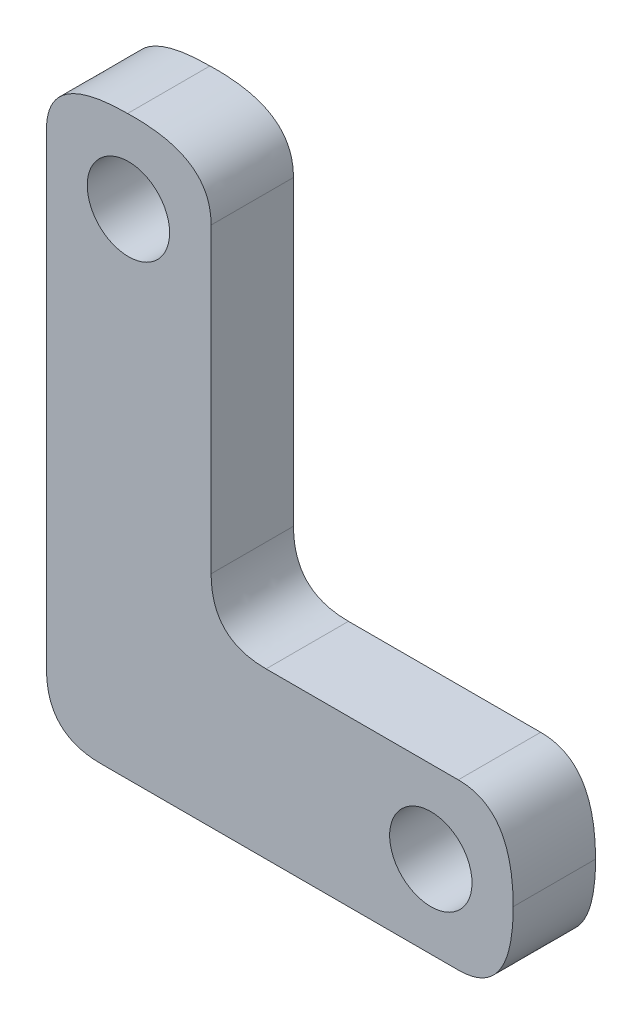
ISO-10303-21;
HEADER;
FILE_DESCRIPTION(('STEP AP214'),'2;1');
FILE_NAME('part.step','',(''),(''),'','','');
FILE_SCHEMA(('AUTOMOTIVE_DESIGN { 1 0 10303 214 1 1 1 1 }'));
ENDSEC;
DATA;
#1=APPLICATION_CONTEXT('core data for automotive mechanical design processes');
#2=APPLICATION_PROTOCOL_DEFINITION('international standard','automotive_design',2000,#1);
#3=PRODUCT_CONTEXT('',#1,'mechanical');
#4=PRODUCT('Part','Part','',(#3));
#5=PRODUCT_RELATED_PRODUCT_CATEGORY('part','',(#4));
#6=PRODUCT_DEFINITION_FORMATION('','',#4);
#7=PRODUCT_DEFINITION_CONTEXT('part definition',#1,'design');
#8=PRODUCT_DEFINITION('design','',#6,#7);
#9=PRODUCT_DEFINITION_SHAPE('','',#8);
#10=(LENGTH_UNIT() NAMED_UNIT(*) SI_UNIT(.MILLI.,.METRE.));
#11=(NAMED_UNIT(*) PLANE_ANGLE_UNIT() SI_UNIT($,.RADIAN.));
#12=(NAMED_UNIT(*) SI_UNIT($,.STERADIAN.) SOLID_ANGLE_UNIT());
#13=UNCERTAINTY_MEASURE_WITH_UNIT(LENGTH_MEASURE(1.E-05),#10,'distance_accuracy_value','');
#14=(GEOMETRIC_REPRESENTATION_CONTEXT(3) GLOBAL_UNCERTAINTY_ASSIGNED_CONTEXT((#13)) GLOBAL_UNIT_ASSIGNED_CONTEXT((#10,
#11,#12)) REPRESENTATION_CONTEXT('',''));
#15=CARTESIAN_POINT('',(0.,0.,0.));
#16=DIRECTION('',(0.,0.,1.));
#17=DIRECTION('',(1.,0.,0.));
#18=AXIS2_PLACEMENT_3D('',#15,#16,#17);
#19=CARTESIAN_POINT('',(0.738825140300366,20.495925714441,3.));
#20=DIRECTION('',(0.,0.,1.));
#21=DIRECTION('',(1.,0.,0.));
#22=AXIS2_PLACEMENT_3D('',#19,#20,#21);
#23=PLANE('',#22);
#24=CARTESIAN_POINT('',(14.,3.,3.));
#25=DIRECTION('',(0.,0.,1.));
#26=DIRECTION('',(1.,0.,0.));
#27=AXIS2_PLACEMENT_3D('',#24,#25,#26);
#28=CIRCLE('',#27,1.5);
#29=CARTESIAN_POINT('',(15.5,3.,3.));
#30=VERTEX_POINT('',#29);
#31=EDGE_CURVE('E244',#30,#30,#28,.T.);
#32=ORIENTED_EDGE('',*,*,#31,.F.);
#33=EDGE_LOOP('',(#32));
#34=FACE_BOUND('',#33,.T.);
#35=CARTESIAN_POINT('',(2.95530056120146,20.9945676192547,3.));
#36=CARTESIAN_POINT('',(0.,20.9945676192547,3.));
#37=CARTESIAN_POINT('',(0.,19.,3.));
#38=B_SPLINE_CURVE_WITH_KNOTS('',2,(#35,#36,#37),.UNSPECIFIED.,.F.,.F.,(3,3),(0.,1.),.UNSPECIFIED.);
#39=CARTESIAN_POINT('',(2.95530056120146,20.9945676192547,3.));
#40=VERTEX_POINT('',#39);
#41=CARTESIAN_POINT('',(0.,19.,3.));
#42=VERTEX_POINT('',#41);
#43=EDGE_CURVE('E248',#40,#42,#38,.T.);
#44=ORIENTED_EDGE('',*,*,#43,.T.);
#45=DIRECTION('',(0.,-1.,0.));
#46=VECTOR('',#45,1.);
#47=CARTESIAN_POINT('',(0.,2.,3.));
#48=LINE('',#47,#46);
#49=CARTESIAN_POINT('',(0.,2.,3.));
#50=VERTEX_POINT('',#49);
#51=EDGE_CURVE('E100',#42,#50,#48,.T.);
#52=ORIENTED_EDGE('',*,*,#51,.T.);
#53=CARTESIAN_POINT('',(0.,2.,3.));
#54=CARTESIAN_POINT('',(0.,0.,3.));
#55=CARTESIAN_POINT('',(2.,0.,3.));
#56=B_SPLINE_CURVE_WITH_KNOTS('',2,(#53,#54,#55),.UNSPECIFIED.,.F.,.F.,(3,3),(0.,1.),.UNSPECIFIED.);
#57=CARTESIAN_POINT('',(2.,0.,3.));
#58=VERTEX_POINT('',#57);
#59=EDGE_CURVE('E197',#50,#58,#56,.T.);
#60=ORIENTED_EDGE('',*,*,#59,.T.);
#61=DIRECTION('',(1.,0.,0.));
#62=VECTOR('',#61,1.);
#63=CARTESIAN_POINT('',(2.,0.,3.));
#64=LINE('',#63,#62);
#65=CARTESIAN_POINT('',(15.0001395445826,0.,3.));
#66=VERTEX_POINT('',#65);
#67=EDGE_CURVE('E192',#58,#66,#64,.T.);
#68=ORIENTED_EDGE('',*,*,#67,.T.);
#69=CARTESIAN_POINT('',(15.0001395445826,0.,3.));
#70=CARTESIAN_POINT('',(17.,0.,3.));
#71=CARTESIAN_POINT('',(17.,3.,3.));
#72=B_SPLINE_CURVE_WITH_KNOTS('',2,(#69,#70,#71),.UNSPECIFIED.,.F.,.F.,(3,3),(0.,1.),.UNSPECIFIED.);
#73=CARTESIAN_POINT('',(17.,3.,3.));
#74=VERTEX_POINT('',#73);
#75=EDGE_CURVE('E184',#66,#74,#72,.T.);
#76=ORIENTED_EDGE('',*,*,#75,.T.);
#77=CARTESIAN_POINT('',(17.,3.,3.));
#78=CARTESIAN_POINT('',(17.,6.,3.));
#79=CARTESIAN_POINT('',(15.,6.,3.));
#80=B_SPLINE_CURVE_WITH_KNOTS('',2,(#77,#78,#79),.UNSPECIFIED.,.F.,.F.,(3,3),(0.,1.),.UNSPECIFIED.);
#81=CARTESIAN_POINT('',(15.,6.,3.));
#82=VERTEX_POINT('',#81);
#83=EDGE_CURVE('E180',#74,#82,#80,.T.);
#84=ORIENTED_EDGE('',*,*,#83,.T.);
#85=DIRECTION('',(-1.,0.,0.));
#86=VECTOR('',#85,1.);
#87=CARTESIAN_POINT('',(8.,6.,3.));
#88=LINE('',#87,#86);
#89=CARTESIAN_POINT('',(8.,6.,3.));
#90=VERTEX_POINT('',#89);
#91=EDGE_CURVE('E125',#82,#90,#88,.T.);
#92=ORIENTED_EDGE('',*,*,#91,.T.);
#93=CARTESIAN_POINT('',(8.,6.,3.));
#94=CARTESIAN_POINT('',(6.,6.,3.));
#95=CARTESIAN_POINT('',(6.,8.,3.));
#96=B_SPLINE_CURVE_WITH_KNOTS('',2,(#93,#94,#95),.UNSPECIFIED.,.F.,.F.,(3,3),(0.,1.),.UNSPECIFIED.);
#97=CARTESIAN_POINT('',(6.,8.,3.));
#98=VERTEX_POINT('',#97);
#99=EDGE_CURVE('E119',#90,#98,#96,.T.);
#100=ORIENTED_EDGE('',*,*,#99,.T.);
#101=DIRECTION('',(0.,1.,0.));
#102=VECTOR('',#101,1.);
#103=CARTESIAN_POINT('',(6.,19.,3.));
#104=LINE('',#103,#102);
#105=CARTESIAN_POINT('',(6.,19.,3.));
#106=VERTEX_POINT('',#105);
#107=EDGE_CURVE('E123',#98,#106,#104,.T.);
#108=ORIENTED_EDGE('',*,*,#107,.T.);
#109=CARTESIAN_POINT('',(6.,19.,3.));
#110=CARTESIAN_POINT('',(5.9912377139321,21.0798174930143,3.));
#111=CARTESIAN_POINT('',(2.95530056120146,20.9945676192547,3.));
#112=B_SPLINE_CURVE_WITH_KNOTS('',2,(#109,#110,#111),.UNSPECIFIED.,.F.,.F.,(3,3),(0.,1.),.UNSPECIFIED.);
#113=EDGE_CURVE('E51',#106,#40,#112,.T.);
#114=ORIENTED_EDGE('',*,*,#113,.T.);
#115=EDGE_LOOP('',(#44,#52,#60,#68,#76,#84,#92,#100,#108,#114));
#116=FACE_BOUND('',#115,.T.);
#117=CARTESIAN_POINT('',(2.9859145073773,17.9947238256048,3.));
#118=DIRECTION('',(0.,0.,1.));
#119=DIRECTION('',(1.,0.,0.));
#120=AXIS2_PLACEMENT_3D('',#117,#118,#119);
#121=CIRCLE('',#120,1.5);
#122=CARTESIAN_POINT('',(4.4859145073773,17.9947238256048,3.));
#123=VERTEX_POINT('',#122);
#124=EDGE_CURVE('E235',#123,#123,#121,.T.);
#125=ORIENTED_EDGE('',*,*,#124,.F.);
#126=EDGE_LOOP('',(#125));
#127=FACE_BOUND('',#126,.T.);
#128=ADVANCED_FACE('F33',(#34,#116,#127),#23,.T.);
#129=CARTESIAN_POINT('',(0.738825140300366,20.495925714441,0.));
#130=DIRECTION('',(0.,0.,1.));
#131=DIRECTION('',(1.,0.,0.));
#132=AXIS2_PLACEMENT_3D('',#129,#130,#131);
#133=PLANE('',#132);
#134=CARTESIAN_POINT('',(2.95530056120146,20.9945676192547,0.));
#135=CARTESIAN_POINT('',(0.,20.9945676192547,0.));
#136=CARTESIAN_POINT('',(0.,19.,0.));
#137=B_SPLINE_CURVE_WITH_KNOTS('',2,(#134,#135,#136),.UNSPECIFIED.,.F.,.F.,(3,3),(0.,1.),.UNSPECIFIED.);
#138=CARTESIAN_POINT('',(2.95530056120146,20.9945676192547,0.));
#139=VERTEX_POINT('',#138);
#140=CARTESIAN_POINT('',(0.,19.,0.));
#141=VERTEX_POINT('',#140);
#142=EDGE_CURVE('E149',#139,#141,#137,.T.);
#143=ORIENTED_EDGE('',*,*,#142,.F.);
#144=CARTESIAN_POINT('',(6.,19.,0.));
#145=CARTESIAN_POINT('',(5.9912377139321,21.0798174930143,0.));
#146=CARTESIAN_POINT('',(2.95530056120146,20.9945676192547,0.));
#147=B_SPLINE_CURVE_WITH_KNOTS('',2,(#144,#145,#146),.UNSPECIFIED.,.F.,.F.,(3,3),(0.,1.),.UNSPECIFIED.);
#148=CARTESIAN_POINT('',(6.,19.,0.));
#149=VERTEX_POINT('',#148);
#150=EDGE_CURVE('E92',#149,#139,#147,.T.);
#151=ORIENTED_EDGE('',*,*,#150,.F.);
#152=DIRECTION('',(0.,1.,0.));
#153=VECTOR('',#152,1.);
#154=CARTESIAN_POINT('',(6.,19.,0.));
#155=LINE('',#154,#153);
#156=CARTESIAN_POINT('',(6.,8.,0.));
#157=VERTEX_POINT('',#156);
#158=EDGE_CURVE('E86',#157,#149,#155,.T.);
#159=ORIENTED_EDGE('',*,*,#158,.F.);
#160=CARTESIAN_POINT('',(8.,6.,0.));
#161=CARTESIAN_POINT('',(6.,6.,0.));
#162=CARTESIAN_POINT('',(6.,8.,0.));
#163=B_SPLINE_CURVE_WITH_KNOTS('',2,(#160,#161,#162),.UNSPECIFIED.,.F.,.F.,(3,3),(0.,1.),.UNSPECIFIED.);
#164=CARTESIAN_POINT('',(8.,6.,0.));
#165=VERTEX_POINT('',#164);
#166=EDGE_CURVE('E133',#165,#157,#163,.T.);
#167=ORIENTED_EDGE('',*,*,#166,.F.);
#168=DIRECTION('',(-1.,0.,0.));
#169=VECTOR('',#168,1.);
#170=CARTESIAN_POINT('',(8.,6.,0.));
#171=LINE('',#170,#169);
#172=CARTESIAN_POINT('',(15.,6.,0.));
#173=VERTEX_POINT('',#172);
#174=EDGE_CURVE('E310',#173,#165,#171,.T.);
#175=ORIENTED_EDGE('',*,*,#174,.F.);
#176=CARTESIAN_POINT('',(17.,3.,0.));
#177=CARTESIAN_POINT('',(17.,6.,0.));
#178=CARTESIAN_POINT('',(15.,6.,0.));
#179=B_SPLINE_CURVE_WITH_KNOTS('',2,(#176,#177,#178),.UNSPECIFIED.,.F.,.F.,(3,3),(0.,1.),.UNSPECIFIED.);
#180=CARTESIAN_POINT('',(17.,3.,0.));
#181=VERTEX_POINT('',#180);
#182=EDGE_CURVE('E303',#181,#173,#179,.T.);
#183=ORIENTED_EDGE('',*,*,#182,.F.);
#184=CARTESIAN_POINT('',(15.0001395445826,0.,0.));
#185=CARTESIAN_POINT('',(17.,0.,0.));
#186=CARTESIAN_POINT('',(17.,3.,0.));
#187=B_SPLINE_CURVE_WITH_KNOTS('',2,(#184,#185,#186),.UNSPECIFIED.,.F.,.F.,(3,3),(0.,1.),.UNSPECIFIED.);
#188=CARTESIAN_POINT('',(15.0001395445826,0.,0.));
#189=VERTEX_POINT('',#188);
#190=EDGE_CURVE('E292',#189,#181,#187,.T.);
#191=ORIENTED_EDGE('',*,*,#190,.F.);
#192=DIRECTION('',(1.,0.,0.));
#193=VECTOR('',#192,1.);
#194=CARTESIAN_POINT('',(2.,0.,0.));
#195=LINE('',#194,#193);
#196=CARTESIAN_POINT('',(2.,0.,0.));
#197=VERTEX_POINT('',#196);
#198=EDGE_CURVE('E290',#197,#189,#195,.T.);
#199=ORIENTED_EDGE('',*,*,#198,.F.);
#200=CARTESIAN_POINT('',(0.,2.,0.));
#201=CARTESIAN_POINT('',(0.,0.,0.));
#202=CARTESIAN_POINT('',(2.,0.,0.));
#203=B_SPLINE_CURVE_WITH_KNOTS('',2,(#200,#201,#202),.UNSPECIFIED.,.F.,.F.,(3,3),(0.,1.),.UNSPECIFIED.);
#204=CARTESIAN_POINT('',(0.,2.,0.));
#205=VERTEX_POINT('',#204);
#206=EDGE_CURVE('E284',#205,#197,#203,.T.);
#207=ORIENTED_EDGE('',*,*,#206,.F.);
#208=DIRECTION('',(0.,-1.,0.));
#209=VECTOR('',#208,1.);
#210=CARTESIAN_POINT('',(0.,2.,0.));
#211=LINE('',#210,#209);
#212=EDGE_CURVE('E288',#141,#205,#211,.T.);
#213=ORIENTED_EDGE('',*,*,#212,.F.);
#214=EDGE_LOOP('',(#143,#151,#159,#167,#175,#183,#191,#199,#207,#213));
#215=FACE_BOUND('',#214,.T.);
#216=CARTESIAN_POINT('',(14.,3.,0.));
#217=DIRECTION('',(0.,0.,1.));
#218=DIRECTION('',(1.,0.,0.));
#219=AXIS2_PLACEMENT_3D('',#216,#217,#218);
#220=CIRCLE('',#219,1.5);
#221=CARTESIAN_POINT('',(15.5,3.,0.));
#222=VERTEX_POINT('',#221);
#223=EDGE_CURVE('E241',#222,#222,#220,.T.);
#224=ORIENTED_EDGE('',*,*,#223,.T.);
#225=EDGE_LOOP('',(#224));
#226=FACE_BOUND('',#225,.T.);
#227=CARTESIAN_POINT('',(2.9859145073773,17.9947238256048,0.));
#228=DIRECTION('',(0.,0.,1.));
#229=DIRECTION('',(1.,0.,0.));
#230=AXIS2_PLACEMENT_3D('',#227,#228,#229);
#231=CIRCLE('',#230,1.5);
#232=CARTESIAN_POINT('',(4.4859145073773,17.9947238256048,0.));
#233=VERTEX_POINT('',#232);
#234=EDGE_CURVE('E238',#233,#233,#231,.T.);
#235=ORIENTED_EDGE('',*,*,#234,.T.);
#236=EDGE_LOOP('',(#235));
#237=FACE_BOUND('',#236,.T.);
#238=ADVANCED_FACE('F162',(#215,#226,#237),#133,.F.);
#239=DIRECTION('',(0.,0.,-1.));
#240=VECTOR('',#239,1.);
#241=SURFACE_OF_LINEAR_EXTRUSION('',#38,#240);
#242=ORIENTED_EDGE('',*,*,#142,.T.);
#243=DIRECTION('',(0.,0.,-1.));
#244=VECTOR('',#243,1.);
#245=CARTESIAN_POINT('',(0.,19.,3.));
#246=LINE('',#245,#244);
#247=EDGE_CURVE('E11',#42,#141,#246,.T.);
#248=ORIENTED_EDGE('',*,*,#247,.F.);
#249=ORIENTED_EDGE('',*,*,#43,.F.);
#250=DIRECTION('',(0.,0.,-1.));
#251=VECTOR('',#250,1.);
#252=CARTESIAN_POINT('',(2.95530056120146,20.9945676192547,3.));
#253=LINE('',#252,#251);
#254=EDGE_CURVE('E139',#40,#139,#253,.T.);
#255=ORIENTED_EDGE('',*,*,#254,.T.);
#256=EDGE_LOOP('',(#242,#248,#249,#255));
#257=FACE_BOUND('',#256,.T.);
#258=ADVANCED_FACE('F35',(#257),#241,.F.);
#259=CARTESIAN_POINT('',(0.,2.,3.));
#260=DIRECTION('',(1.,0.,0.));
#261=DIRECTION('',(0.,0.,-1.));
#262=AXIS2_PLACEMENT_3D('',#259,#260,#261);
#263=PLANE('',#262);
#264=ORIENTED_EDGE('',*,*,#212,.T.);
#265=DIRECTION('',(0.,0.,-1.));
#266=VECTOR('',#265,1.);
#267=CARTESIAN_POINT('',(0.,2.,3.));
#268=LINE('',#267,#266);
#269=EDGE_CURVE('E43',#50,#205,#268,.T.);
#270=ORIENTED_EDGE('',*,*,#269,.F.);
#271=ORIENTED_EDGE('',*,*,#51,.F.);
#272=ORIENTED_EDGE('',*,*,#247,.T.);
#273=EDGE_LOOP('',(#264,#270,#271,#272));
#274=FACE_BOUND('',#273,.T.);
#275=ADVANCED_FACE('F209',(#274),#263,.F.);
#276=DIRECTION('',(0.,0.,-1.));
#277=VECTOR('',#276,1.);
#278=SURFACE_OF_LINEAR_EXTRUSION('',#56,#277);
#279=ORIENTED_EDGE('',*,*,#206,.T.);
#280=DIRECTION('',(0.,0.,-1.));
#281=VECTOR('',#280,1.);
#282=CARTESIAN_POINT('',(2.,0.,3.));
#283=LINE('',#282,#281);
#284=EDGE_CURVE('E278',#58,#197,#283,.T.);
#285=ORIENTED_EDGE('',*,*,#284,.F.);
#286=ORIENTED_EDGE('',*,*,#59,.F.);
#287=ORIENTED_EDGE('',*,*,#269,.T.);
#288=EDGE_LOOP('',(#279,#285,#286,#287));
#289=FACE_BOUND('',#288,.T.);
#290=ADVANCED_FACE('F206',(#289),#278,.F.);
#291=CARTESIAN_POINT('',(2.,0.,3.));
#292=DIRECTION('',(0.,1.,0.));
#293=DIRECTION('',(0.,0.,1.));
#294=AXIS2_PLACEMENT_3D('',#291,#292,#293);
#295=PLANE('',#294);
#296=ORIENTED_EDGE('',*,*,#198,.T.);
#297=DIRECTION('',(0.,0.,-1.));
#298=VECTOR('',#297,1.);
#299=CARTESIAN_POINT('',(15.0001395445826,0.,3.));
#300=LINE('',#299,#298);
#301=EDGE_CURVE('E275',#66,#189,#300,.T.);
#302=ORIENTED_EDGE('',*,*,#301,.F.);
#303=ORIENTED_EDGE('',*,*,#67,.F.);
#304=ORIENTED_EDGE('',*,*,#284,.T.);
#305=EDGE_LOOP('',(#296,#302,#303,#304));
#306=FACE_BOUND('',#305,.T.);
#307=ADVANCED_FACE('F208',(#306),#295,.F.);
#308=DIRECTION('',(0.,0.,-1.));
#309=VECTOR('',#308,1.);
#310=SURFACE_OF_LINEAR_EXTRUSION('',#72,#309);
#311=ORIENTED_EDGE('',*,*,#190,.T.);
#312=DIRECTION('',(0.,0.,-1.));
#313=VECTOR('',#312,1.);
#314=CARTESIAN_POINT('',(17.,3.,3.));
#315=LINE('',#314,#313);
#316=EDGE_CURVE('E272',#74,#181,#315,.T.);
#317=ORIENTED_EDGE('',*,*,#316,.F.);
#318=ORIENTED_EDGE('',*,*,#75,.F.);
#319=ORIENTED_EDGE('',*,*,#301,.T.);
#320=EDGE_LOOP('',(#311,#317,#318,#319));
#321=FACE_BOUND('',#320,.T.);
#322=ADVANCED_FACE('F176',(#321),#310,.F.);
#323=DIRECTION('',(0.,0.,-1.));
#324=VECTOR('',#323,1.);
#325=SURFACE_OF_LINEAR_EXTRUSION('',#80,#324);
#326=ORIENTED_EDGE('',*,*,#182,.T.);
#327=DIRECTION('',(0.,0.,-1.));
#328=VECTOR('',#327,1.);
#329=CARTESIAN_POINT('',(15.,6.,3.));
#330=LINE('',#329,#328);
#331=EDGE_CURVE('E269',#82,#173,#330,.T.);
#332=ORIENTED_EDGE('',*,*,#331,.F.);
#333=ORIENTED_EDGE('',*,*,#83,.F.);
#334=ORIENTED_EDGE('',*,*,#316,.T.);
#335=EDGE_LOOP('',(#326,#332,#333,#334));
#336=FACE_BOUND('',#335,.T.);
#337=ADVANCED_FACE('F171',(#336),#325,.F.);
#338=CARTESIAN_POINT('',(8.,6.,3.));
#339=DIRECTION('',(0.,-1.,0.));
#340=DIRECTION('',(0.,0.,-1.));
#341=AXIS2_PLACEMENT_3D('',#338,#339,#340);
#342=PLANE('',#341);
#343=ORIENTED_EDGE('',*,*,#174,.T.);
#344=DIRECTION('',(0.,0.,-1.));
#345=VECTOR('',#344,1.);
#346=CARTESIAN_POINT('',(8.,6.,3.));
#347=LINE('',#346,#345);
#348=EDGE_CURVE('E134',#90,#165,#347,.T.);
#349=ORIENTED_EDGE('',*,*,#348,.F.);
#350=ORIENTED_EDGE('',*,*,#91,.F.);
#351=ORIENTED_EDGE('',*,*,#331,.T.);
#352=EDGE_LOOP('',(#343,#349,#350,#351));
#353=FACE_BOUND('',#352,.T.);
#354=ADVANCED_FACE('F168',(#353),#342,.F.);
#355=DIRECTION('',(0.,0.,-1.));
#356=VECTOR('',#355,1.);
#357=SURFACE_OF_LINEAR_EXTRUSION('',#96,#356);
#358=ORIENTED_EDGE('',*,*,#166,.T.);
#359=DIRECTION('',(0.,0.,-1.));
#360=VECTOR('',#359,1.);
#361=CARTESIAN_POINT('',(6.,8.,3.));
#362=LINE('',#361,#360);
#363=EDGE_CURVE('E130',#98,#157,#362,.T.);
#364=ORIENTED_EDGE('',*,*,#363,.F.);
#365=ORIENTED_EDGE('',*,*,#99,.F.);
#366=ORIENTED_EDGE('',*,*,#348,.T.);
#367=EDGE_LOOP('',(#358,#364,#365,#366));
#368=FACE_BOUND('',#367,.T.);
#369=ADVANCED_FACE('F131',(#368),#357,.F.);
#370=CARTESIAN_POINT('',(6.,19.,3.));
#371=DIRECTION('',(-1.,0.,0.));
#372=DIRECTION('',(0.,-1.,0.));
#373=AXIS2_PLACEMENT_3D('',#370,#371,#372);
#374=PLANE('',#373);
#375=ORIENTED_EDGE('',*,*,#158,.T.);
#376=DIRECTION('',(0.,0.,-1.));
#377=VECTOR('',#376,1.);
#378=CARTESIAN_POINT('',(6.,19.,3.));
#379=LINE('',#378,#377);
#380=EDGE_CURVE('E135',#106,#149,#379,.T.);
#381=ORIENTED_EDGE('',*,*,#380,.F.);
#382=ORIENTED_EDGE('',*,*,#107,.F.);
#383=ORIENTED_EDGE('',*,*,#363,.T.);
#384=EDGE_LOOP('',(#375,#381,#382,#383));
#385=FACE_BOUND('',#384,.T.);
#386=ADVANCED_FACE('F137',(#385),#374,.F.);
#387=DIRECTION('',(0.,0.,-1.));
#388=VECTOR('',#387,1.);
#389=SURFACE_OF_LINEAR_EXTRUSION('',#112,#388);
#390=ORIENTED_EDGE('',*,*,#150,.T.);
#391=ORIENTED_EDGE('',*,*,#254,.F.);
#392=ORIENTED_EDGE('',*,*,#113,.F.);
#393=ORIENTED_EDGE('',*,*,#380,.T.);
#394=EDGE_LOOP('',(#390,#391,#392,#393));
#395=FACE_BOUND('',#394,.T.);
#396=ADVANCED_FACE('F157',(#395),#389,.F.);
#397=CARTESIAN_POINT('',(14.,3.,3.));
#398=DIRECTION('',(0.,0.,-1.));
#399=DIRECTION('',(-1.,0.,0.));
#400=AXIS2_PLACEMENT_3D('',#397,#398,#399);
#401=CYLINDRICAL_SURFACE('',#400,1.5);
#402=ORIENTED_EDGE('',*,*,#31,.T.);
#403=EDGE_LOOP('',(#402));
#404=FACE_BOUND('',#403,.T.);
#405=ORIENTED_EDGE('',*,*,#223,.F.);
#406=EDGE_LOOP('',(#405));
#407=FACE_BOUND('',#406,.T.);
#408=ADVANCED_FACE('F161',(#404,#407),#401,.F.);
#409=CARTESIAN_POINT('',(2.9859145073773,17.9947238256048,3.));
#410=DIRECTION('',(0.,0.,-1.));
#411=DIRECTION('',(-1.,0.,0.));
#412=AXIS2_PLACEMENT_3D('',#409,#410,#411);
#413=CYLINDRICAL_SURFACE('',#412,1.5);
#414=ORIENTED_EDGE('',*,*,#124,.T.);
#415=EDGE_LOOP('',(#414));
#416=FACE_BOUND('',#415,.T.);
#417=ORIENTED_EDGE('',*,*,#234,.F.);
#418=EDGE_LOOP('',(#417));
#419=FACE_BOUND('',#418,.T.);
#420=ADVANCED_FACE('F226',(#416,#419),#413,.F.);
#421=CLOSED_SHELL('',(#128,#238,#258,#275,#290,#307,#322,#337,#354,#369,#386,#396,#408,#420));
#422=MANIFOLD_SOLID_BREP('B2',#421);
#423=ADVANCED_BREP_SHAPE_REPRESENTATION('',(#18,#422),#14);
#424=SHAPE_DEFINITION_REPRESENTATION(#9,#423);
ENDSEC;
END-ISO-10303-21;
